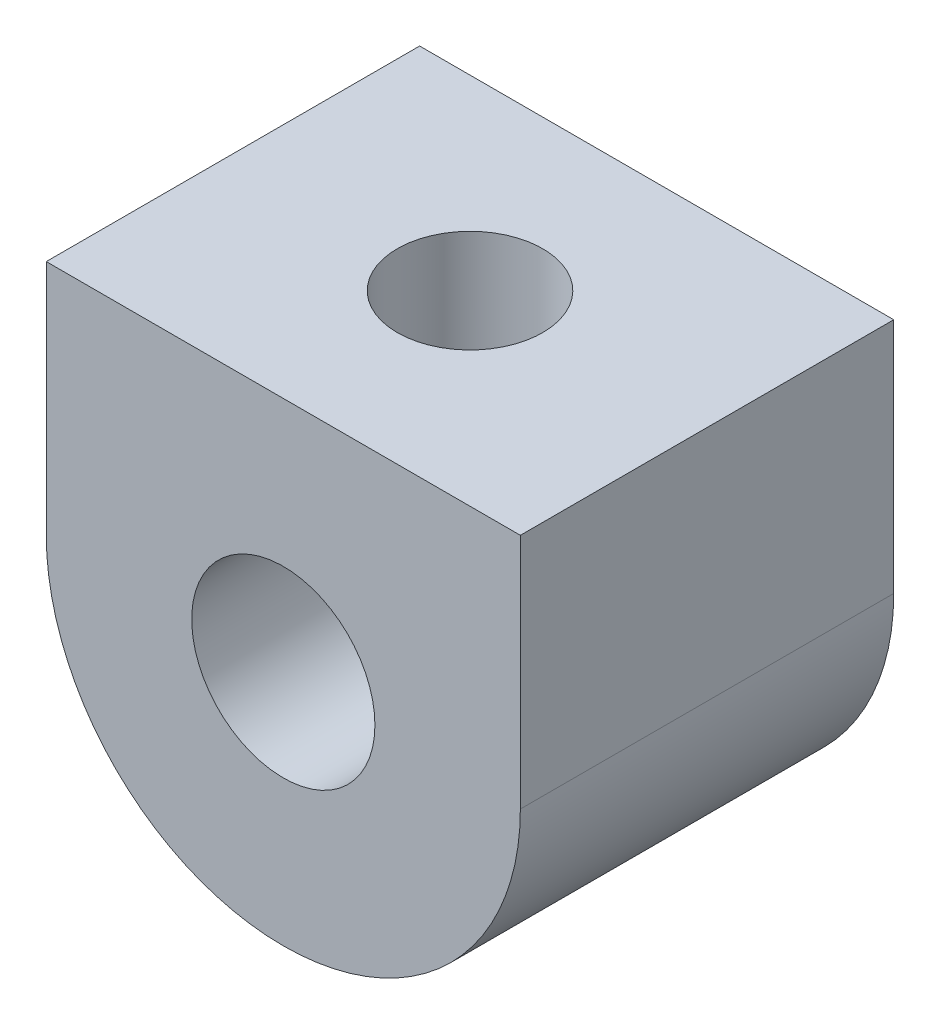
ISO-10303-21;
HEADER;
FILE_DESCRIPTION(('STEP AP214'),'2;1');
FILE_NAME('part.step','',(''),(''),'','','');
FILE_SCHEMA(('AUTOMOTIVE_DESIGN { 1 0 10303 214 1 1 1 1 }'));
ENDSEC;
DATA;
#1=APPLICATION_CONTEXT('core data for automotive mechanical design processes');
#2=APPLICATION_PROTOCOL_DEFINITION('international standard','automotive_design',2000,#1);
#3=PRODUCT_CONTEXT('',#1,'mechanical');
#4=PRODUCT('Part','Part','',(#3));
#5=PRODUCT_RELATED_PRODUCT_CATEGORY('part','',(#4));
#6=PRODUCT_DEFINITION_FORMATION('','',#4);
#7=PRODUCT_DEFINITION_CONTEXT('part definition',#1,'design');
#8=PRODUCT_DEFINITION('design','',#6,#7);
#9=PRODUCT_DEFINITION_SHAPE('','',#8);
#10=(LENGTH_UNIT() NAMED_UNIT(*) SI_UNIT(.MILLI.,.METRE.));
#11=(NAMED_UNIT(*) PLANE_ANGLE_UNIT() SI_UNIT($,.RADIAN.));
#12=(NAMED_UNIT(*) SI_UNIT($,.STERADIAN.) SOLID_ANGLE_UNIT());
#13=UNCERTAINTY_MEASURE_WITH_UNIT(LENGTH_MEASURE(1.E-05),#10,'distance_accuracy_value','');
#14=(GEOMETRIC_REPRESENTATION_CONTEXT(3) GLOBAL_UNCERTAINTY_ASSIGNED_CONTEXT((#13)) GLOBAL_UNIT_ASSIGNED_CONTEXT((#10,
#11,#12)) REPRESENTATION_CONTEXT('',''));
#15=CARTESIAN_POINT('',(0.,0.,0.));
#16=DIRECTION('',(0.,0.,1.));
#17=DIRECTION('',(1.,0.,0.));
#18=AXIS2_PLACEMENT_3D('',#15,#16,#17);
#19=CARTESIAN_POINT('',(0.,0.,16.301974));
#20=DIRECTION('',(0.,0.,1.));
#21=DIRECTION('',(1.,0.,0.));
#22=AXIS2_PLACEMENT_3D('',#19,#20,#21);
#23=PLANE('',#22);
#24=CARTESIAN_POINT('',(0.,0.,16.301974));
#25=DIRECTION('',(0.,0.,1.));
#26=DIRECTION('',(1.,0.,0.));
#27=AXIS2_PLACEMENT_3D('',#24,#25,#26);
#28=CIRCLE('',#27,10.349992);
#29=CARTESIAN_POINT('',(-10.349992,0.,16.301974));
#30=VERTEX_POINT('',#29);
#31=CARTESIAN_POINT('',(10.349992,0.,16.301974));
#32=VERTEX_POINT('',#31);
#33=EDGE_CURVE('E90',#30,#32,#28,.T.);
#34=ORIENTED_EDGE('',*,*,#33,.T.);
#35=DIRECTION('',(0.,1.,0.));
#36=VECTOR('',#35,1.);
#37=CARTESIAN_POINT('',(10.349992,10.349992,16.301974));
#38=LINE('',#37,#36);
#39=CARTESIAN_POINT('',(10.349992,10.349992,16.301974));
#40=VERTEX_POINT('',#39);
#41=EDGE_CURVE('E85',#32,#40,#38,.T.);
#42=ORIENTED_EDGE('',*,*,#41,.T.);
#43=DIRECTION('',(-1.,0.,0.));
#44=VECTOR('',#43,1.);
#45=CARTESIAN_POINT('',(0.,10.349992,16.301974));
#46=LINE('',#45,#44);
#47=CARTESIAN_POINT('',(-10.349992,10.349992,16.301974));
#48=VERTEX_POINT('',#47);
#49=EDGE_CURVE('E88',#40,#48,#46,.T.);
#50=ORIENTED_EDGE('',*,*,#49,.T.);
#51=DIRECTION('',(0.,-1.,0.));
#52=VECTOR('',#51,1.);
#53=CARTESIAN_POINT('',(-10.349992,0.,16.301974));
#54=LINE('',#53,#52);
#55=EDGE_CURVE('E56',#48,#30,#54,.T.);
#56=ORIENTED_EDGE('',*,*,#55,.T.);
#57=EDGE_LOOP('',(#34,#42,#50,#56));
#58=FACE_BOUND('',#57,.T.);
#59=CARTESIAN_POINT('',(0.,0.,16.301974));
#60=DIRECTION('',(0.,0.,1.));
#61=DIRECTION('',(1.,0.,0.));
#62=AXIS2_PLACEMENT_3D('',#59,#60,#61);
#63=CIRCLE('',#62,3.999992);
#64=CARTESIAN_POINT('',(3.999992,0.,16.301974));
#65=VERTEX_POINT('',#64);
#66=EDGE_CURVE('E106',#65,#65,#63,.T.);
#67=ORIENTED_EDGE('',*,*,#66,.F.);
#68=EDGE_LOOP('',(#67));
#69=FACE_BOUND('',#68,.T.);
#70=ADVANCED_FACE('F39',(#58,#69),#23,.T.);
#71=CARTESIAN_POINT('',(0.,0.,0.));
#72=DIRECTION('',(0.,0.,1.));
#73=DIRECTION('',(1.,0.,0.));
#74=AXIS2_PLACEMENT_3D('',#71,#72,#73);
#75=PLANE('',#74);
#76=CARTESIAN_POINT('',(0.,0.,0.));
#77=DIRECTION('',(0.,0.,1.));
#78=DIRECTION('',(1.,0.,0.));
#79=AXIS2_PLACEMENT_3D('',#76,#77,#78);
#80=CIRCLE('',#79,10.349992);
#81=CARTESIAN_POINT('',(-10.349992,0.,0.));
#82=VERTEX_POINT('',#81);
#83=CARTESIAN_POINT('',(10.349992,0.,0.));
#84=VERTEX_POINT('',#83);
#85=EDGE_CURVE('E103',#82,#84,#80,.T.);
#86=ORIENTED_EDGE('',*,*,#85,.F.);
#87=DIRECTION('',(0.,-1.,0.));
#88=VECTOR('',#87,1.);
#89=CARTESIAN_POINT('',(-10.349992,0.,0.));
#90=LINE('',#89,#88);
#91=CARTESIAN_POINT('',(-10.349992,10.349992,0.));
#92=VERTEX_POINT('',#91);
#93=EDGE_CURVE('E78',#92,#82,#90,.T.);
#94=ORIENTED_EDGE('',*,*,#93,.F.);
#95=DIRECTION('',(-1.,0.,0.));
#96=VECTOR('',#95,1.);
#97=CARTESIAN_POINT('',(-10.349992,10.349992,0.));
#98=LINE('',#97,#96);
#99=CARTESIAN_POINT('',(10.349992,10.349992,0.));
#100=VERTEX_POINT('',#99);
#101=EDGE_CURVE('E72',#100,#92,#98,.T.);
#102=ORIENTED_EDGE('',*,*,#101,.F.);
#103=DIRECTION('',(0.,1.,0.));
#104=VECTOR('',#103,1.);
#105=CARTESIAN_POINT('',(10.349992,10.349992,0.));
#106=LINE('',#105,#104);
#107=EDGE_CURVE('E95',#84,#100,#106,.T.);
#108=ORIENTED_EDGE('',*,*,#107,.F.);
#109=EDGE_LOOP('',(#86,#94,#102,#108));
#110=FACE_BOUND('',#109,.T.);
#111=CARTESIAN_POINT('',(0.,0.,0.));
#112=DIRECTION('',(0.,0.,1.));
#113=DIRECTION('',(1.,0.,0.));
#114=AXIS2_PLACEMENT_3D('',#111,#112,#113);
#115=CIRCLE('',#114,3.999992);
#116=CARTESIAN_POINT('',(3.999992,0.,0.));
#117=VERTEX_POINT('',#116);
#118=EDGE_CURVE('E118',#117,#117,#115,.T.);
#119=ORIENTED_EDGE('',*,*,#118,.T.);
#120=EDGE_LOOP('',(#119));
#121=FACE_BOUND('',#120,.T.);
#122=ADVANCED_FACE('F114',(#110,#121),#75,.F.);
#123=CARTESIAN_POINT('',(0.,0.,16.301974));
#124=DIRECTION('',(0.,0.,-1.));
#125=DIRECTION('',(-1.,0.,0.));
#126=AXIS2_PLACEMENT_3D('',#123,#124,#125);
#127=CYLINDRICAL_SURFACE('',#126,10.349992);
#128=ORIENTED_EDGE('',*,*,#85,.T.);
#129=DIRECTION('',(0.,0.,-1.));
#130=VECTOR('',#129,1.);
#131=CARTESIAN_POINT('',(10.349992,0.,16.301974));
#132=LINE('',#131,#130);
#133=EDGE_CURVE('E11',#32,#84,#132,.T.);
#134=ORIENTED_EDGE('',*,*,#133,.F.);
#135=ORIENTED_EDGE('',*,*,#33,.F.);
#136=DIRECTION('',(0.,0.,-1.));
#137=VECTOR('',#136,1.);
#138=CARTESIAN_POINT('',(-10.349992,0.,16.301974));
#139=LINE('',#138,#137);
#140=EDGE_CURVE('E99',#30,#82,#139,.T.);
#141=ORIENTED_EDGE('',*,*,#140,.T.);
#142=EDGE_LOOP('',(#128,#134,#135,#141));
#143=FACE_BOUND('',#142,.T.);
#144=ADVANCED_FACE('F41',(#143),#127,.T.);
#145=CARTESIAN_POINT('',(10.349992,10.349992,16.301974));
#146=DIRECTION('',(-1.,0.,0.));
#147=DIRECTION('',(0.,0.,1.));
#148=AXIS2_PLACEMENT_3D('',#145,#146,#147);
#149=PLANE('',#148);
#150=ORIENTED_EDGE('',*,*,#107,.T.);
#151=DIRECTION('',(0.,0.,-1.));
#152=VECTOR('',#151,1.);
#153=CARTESIAN_POINT('',(10.349992,10.349992,16.301974));
#154=LINE('',#153,#152);
#155=EDGE_CURVE('E48',#40,#100,#154,.T.);
#156=ORIENTED_EDGE('',*,*,#155,.F.);
#157=ORIENTED_EDGE('',*,*,#41,.F.);
#158=ORIENTED_EDGE('',*,*,#133,.T.);
#159=EDGE_LOOP('',(#150,#156,#157,#158));
#160=FACE_BOUND('',#159,.T.);
#161=ADVANCED_FACE('F94',(#160),#149,.F.);
#162=CARTESIAN_POINT('',(-10.349992,10.349992,16.301974));
#163=DIRECTION('',(0.,-1.,0.));
#164=DIRECTION('',(0.,0.,-1.));
#165=AXIS2_PLACEMENT_3D('',#162,#163,#164);
#166=PLANE('',#165);
#167=CARTESIAN_POINT('',(0.,10.349992,8.150987));
#168=DIRECTION('',(0.,1.,0.));
#169=DIRECTION('',(0.,0.,1.));
#170=AXIS2_PLACEMENT_3D('',#167,#168,#169);
#171=CIRCLE('',#170,3.175);
#172=CARTESIAN_POINT('',(0.,10.349992,11.325987));
#173=VERTEX_POINT('',#172);
#174=EDGE_CURVE('E121',#173,#173,#171,.T.);
#175=ORIENTED_EDGE('',*,*,#174,.F.);
#176=EDGE_LOOP('',(#175));
#177=FACE_BOUND('',#176,.T.);
#178=ORIENTED_EDGE('',*,*,#101,.T.);
#179=DIRECTION('',(0.,0.,-1.));
#180=VECTOR('',#179,1.);
#181=CARTESIAN_POINT('',(-10.349992,10.349992,16.301974));
#182=LINE('',#181,#180);
#183=EDGE_CURVE('E96',#48,#92,#182,.T.);
#184=ORIENTED_EDGE('',*,*,#183,.F.);
#185=ORIENTED_EDGE('',*,*,#49,.F.);
#186=ORIENTED_EDGE('',*,*,#155,.T.);
#187=EDGE_LOOP('',(#178,#184,#185,#186));
#188=FACE_BOUND('',#187,.T.);
#189=ADVANCED_FACE('F97',(#177,#188),#166,.F.);
#190=CARTESIAN_POINT('',(-10.349992,0.,16.301974));
#191=DIRECTION('',(1.,0.,0.));
#192=DIRECTION('',(0.,0.,-1.));
#193=AXIS2_PLACEMENT_3D('',#190,#191,#192);
#194=PLANE('',#193);
#195=ORIENTED_EDGE('',*,*,#93,.T.);
#196=ORIENTED_EDGE('',*,*,#140,.F.);
#197=ORIENTED_EDGE('',*,*,#55,.F.);
#198=ORIENTED_EDGE('',*,*,#183,.T.);
#199=EDGE_LOOP('',(#195,#196,#197,#198));
#200=FACE_BOUND('',#199,.T.);
#201=ADVANCED_FACE('F111',(#200),#194,.F.);
#202=CARTESIAN_POINT('',(0.,0.,16.301974));
#203=DIRECTION('',(0.,0.,-1.));
#204=DIRECTION('',(-1.,0.,0.));
#205=AXIS2_PLACEMENT_3D('',#202,#203,#204);
#206=CYLINDRICAL_SURFACE('',#205,3.999992);
#207=CARTESIAN_POINT('',(0.,3.999992,11.325987));
#208=CARTESIAN_POINT('',(0.0764201524682931,3.99999170906093,11.3259867011535));
#209=CARTESIAN_POINT('',(0.152844768826001,3.99779718336271,11.3232232527382));
#210=CARTESIAN_POINT('',(0.305078280690546,3.98907019279326,11.3122179243916));
#211=CARTESIAN_POINT('',(0.380886879226333,3.98253574831137,11.3039735443863));
#212=CARTESIAN_POINT('',(0.531354391850129,3.96526645626063,11.282132525921));
#213=CARTESIAN_POINT('',(0.606011544591902,3.95452573110043,11.2685283979261));
#214=CARTESIAN_POINT('',(0.753532310677379,3.92908920862785,11.2361982584159));
#215=CARTESIAN_POINT('',(0.826395103545464,3.91439163738734,11.2174699495728));
#216=CARTESIAN_POINT('',(1.04059319784093,3.86502331099184,11.1542847333464));
#217=CARTESIAN_POINT('',(1.17865822429612,3.82494160032923,11.1026591614401));
#218=CARTESIAN_POINT('',(1.443015316839,3.73327061284736,10.9828542268298));
#219=CARTESIAN_POINT('',(1.56930652605034,3.68168049939368,10.9146736605838));
#220=CARTESIAN_POINT('',(1.85031496533093,3.55074355122578,10.7380994150622));
#221=CARTESIAN_POINT('',(1.99985268322663,3.46795512967257,10.6239421624735));
#222=CARTESIAN_POINT('',(2.20567459285971,3.33790364548653,10.4366577875153));
#223=CARTESIAN_POINT('',(2.27130993002217,3.29348347556521,10.3714132370476));
#224=CARTESIAN_POINT('',(2.39634891625606,3.20364703806688,10.2358436693441));
#225=CARTESIAN_POINT('',(2.45575502945502,3.1582311730238,10.1655206797453));
#226=CARTESIAN_POINT('',(2.56911760314859,3.06675078398574,10.0188697304842));
#227=CARTESIAN_POINT('',(2.62297686195875,3.02068695830982,9.94246640143855));
#228=CARTESIAN_POINT('',(2.72408134395716,2.92983508145708,9.78463074147792));
#229=CARTESIAN_POINT('',(2.77132451622418,2.8850474292934,9.70319686236631));
#230=CARTESIAN_POINT('',(2.85879317505296,2.79839508579409,9.53548870958345));
#231=CARTESIAN_POINT('',(2.89903798628882,2.75652254328452,9.44922866318111));
#232=CARTESIAN_POINT('',(2.97219327779644,2.67748035072502,9.27165902907376));
#233=CARTESIAN_POINT('',(3.00510997999557,2.64030672274561,9.1803538078332));
#234=CARTESIAN_POINT('',(3.06761713986995,2.56755085838339,8.9776183241923));
#235=CARTESIAN_POINT('',(3.09583083774778,2.53317673182661,8.8653067121427));
#236=CARTESIAN_POINT('',(3.14003940451433,2.47817699528291,8.63517576494079));
#237=CARTESIAN_POINT('',(3.15606393551703,2.45751802541707,8.51737054538399));
#238=CARTESIAN_POINT('',(3.17474914652227,2.43334593463208,8.2778640491655));
#239=CARTESIAN_POINT('',(3.17729964464791,2.42997418392342,8.1561388152743));
#240=CARTESIAN_POINT('',(3.16846774865672,2.44147120267906,7.9140243745368));
#241=CARTESIAN_POINT('',(3.15707230196813,2.45635706020332,7.79363652588156));
#242=CARTESIAN_POINT('',(3.11841700647846,2.50529493966078,7.53821334714582));
#243=CARTESIAN_POINT('',(3.08882416776139,2.54213425722156,7.40409244409449));
#244=CARTESIAN_POINT('',(3.01441228025947,2.62992999537597,7.1448825803109));
#245=CARTESIAN_POINT('',(2.96954902956073,2.6809273179864,7.01982113231154));
#246=CARTESIAN_POINT('',(2.88000736261499,2.77643599266738,6.81104217104248));
#247=CARTESIAN_POINT('',(2.838396798028,2.81911414914011,6.7251155035067));
#248=CARTESIAN_POINT('',(2.74826777443825,2.90704712702707,6.55830272247074));
#249=CARTESIAN_POINT('',(2.69974627138771,2.95230307857841,6.47741885285412));
#250=CARTESIAN_POINT('',(2.59600343367509,3.04392732574603,6.32062377535256));
#251=CARTESIAN_POINT('',(2.54077682526506,3.0902964736241,6.24471655494707));
#252=CARTESIAN_POINT('',(2.42378635847876,3.18288903444108,6.09801352650583));
#253=CARTESIAN_POINT('',(2.36201918357586,3.22911236108706,6.02722034254679));
#254=CARTESIAN_POINT('',(2.16392635212314,3.36803458347904,5.81964632541459));
#255=CARTESIAN_POINT('',(2.01710203207852,3.45885683946416,5.69116167989439));
#256=CARTESIAN_POINT('',(1.77755072755374,3.58446779724067,5.5183819123927));
#257=CARTESIAN_POINT('',(1.69454197561839,3.62454487862247,5.46414226857043));
#258=CARTESIAN_POINT('',(1.52228702609582,3.70019096540315,5.36293345156385));
#259=CARTESIAN_POINT('',(1.43304373825836,3.73576205229485,5.3159609191846));
#260=CARTESIAN_POINT('',(1.21023774104306,3.81502945098968,5.21216302692044));
#261=CARTESIAN_POINT('',(1.07371843769143,3.85592414162665,5.15940306015492));
#262=CARTESIAN_POINT('',(0.791534058123141,3.92357308954037,5.07270000482878));
#263=CARTESIAN_POINT('',(0.645876021578844,3.9503380850244,5.03874262582008));
#264=CARTESIAN_POINT('',(0.348399322183865,3.98761888067492,4.99155561534416));
#265=CARTESIAN_POINT('',(0.196554378712527,3.99805584065299,4.97842654947537));
#266=CARTESIAN_POINT('',(-0.107635365857988,4.00143398134721,4.97417004705894));
#267=CARTESIAN_POINT('',(-0.259980101375985,3.99437737249061,4.98303983081233));
#268=CARTESIAN_POINT('',(-0.548806937749803,3.96462561264276,5.02064183186426));
#269=CARTESIAN_POINT('',(-0.685622433706433,3.94314152182204,5.04783640835983));
#270=CARTESIAN_POINT('',(-0.952083033858267,3.88741815245626,5.11895863651966));
#271=CARTESIAN_POINT('',(-1.0817258600334,3.85317484802558,5.16289156969815));
#272=CARTESIAN_POINT('',(-1.34011888625492,3.77142315288669,5.26905209550182));
#273=CARTESIAN_POINT('',(-1.46819471554869,3.72316453193368,5.33232994985261));
#274=CARTESIAN_POINT('',(-1.71191344927169,3.61758856723252,5.47333510102658));
#275=CARTESIAN_POINT('',(-1.82755614035384,3.56027106807974,5.55106264573752));
#276=CARTESIAN_POINT('',(-2.06665154254878,3.4279660315775,5.73510170838895));
#277=CARTESIAN_POINT('',(-2.18736593654031,3.35169583026037,5.84403683618337));
#278=CARTESIAN_POINT('',(-2.41016976062434,3.19524311456047,6.07784972242619));
#279=CARTESIAN_POINT('',(-2.51219849802495,3.11504888708576,6.20277726915328));
#280=CARTESIAN_POINT('',(-2.66006787321715,2.98820468544809,6.41486792648925));
#281=CARTESIAN_POINT('',(-2.71214027906522,2.94087000539524,6.4973480234314));
#282=CARTESIAN_POINT('',(-2.80899575208937,2.84849964372823,6.66781917101945));
#283=CARTESIAN_POINT('',(-2.85377483222696,2.8034652287701,6.7558131998115));
#284=CARTESIAN_POINT('',(-2.93541129110254,2.7178632423184,6.93698004240776));
#285=CARTESIAN_POINT('',(-2.97230144759639,2.67727754385612,7.03012932035672));
#286=CARTESIAN_POINT('',(-3.03768385502439,2.60285698696341,7.2218259747362));
#287=CARTESIAN_POINT('',(-3.0661873626146,2.5690130994979,7.32036590301294));
#288=CARTESIAN_POINT('',(-3.11562783633092,2.5088717222822,7.52981151643891));
#289=CARTESIAN_POINT('',(-3.13587434037789,2.48329079472888,7.64109702887479));
#290=CARTESIAN_POINT('',(-3.16435850035436,2.44690291529942,7.8674247880795));
#291=CARTESIAN_POINT('',(-3.17262348600591,2.43606234433738,7.98245787137615));
#292=CARTESIAN_POINT('',(-3.17649195247935,2.43101862831518,8.2135291761449));
#293=CARTESIAN_POINT('',(-3.17205156704929,2.43687312399657,8.3295694975815));
#294=CARTESIAN_POINT('',(-3.1508239920807,2.46424803075378,8.55870206609445));
#295=CARTESIAN_POINT('',(-3.13401535772665,2.48579565085,8.67178883904164));
#296=CARTESIAN_POINT('',(-3.08182550803855,2.55039213827513,8.92911936158599));
#297=CARTESIAN_POINT('',(-3.04213264080678,2.59820267534003,9.07125259443149));
#298=CARTESIAN_POINT('',(-2.94575287696846,2.70698072401493,9.34442141173653));
#299=CARTESIAN_POINT('',(-2.88901303228219,2.76798906038118,9.47542076382511));
#300=CARTESIAN_POINT('',(-2.77940752583487,2.87731498443153,9.6889439054498));
#301=CARTESIAN_POINT('',(-2.73038709278259,2.9240274255505,9.77431856220123));
#302=CARTESIAN_POINT('',(-2.62508280372217,3.01892522453508,9.9396112104994));
#303=CARTESIAN_POINT('',(-2.56879608243111,3.06711115768553,10.0195270303766));
#304=CARTESIAN_POINT('',(-2.38934620339838,3.21161222148973,10.2509287603855));
#305=CARTESIAN_POINT('',(-2.25545995506679,3.30801151834321,10.3943267961786));
#306=CARTESIAN_POINT('',(-1.98441579843781,3.47608649846195,10.634911639601));
#307=CARTESIAN_POINT('',(-1.85144153981534,3.54921729038588,10.7358193169706));
#308=CARTESIAN_POINT('',(-1.56699488943738,3.68362700516951,10.9174902716688));
#309=CARTESIAN_POINT('',(-1.41554792827044,3.7449219281008,10.9982807873759));
#310=CARTESIAN_POINT('',(-1.12405426728425,3.84131719506695,11.1238172027964));
#311=CARTESIAN_POINT('',(-0.986572389477884,3.87911524106895,11.1723817109523));
#312=CARTESIAN_POINT('',(-0.774319461298541,3.92499964170298,11.2309957051328));
#313=CARTESIAN_POINT('',(-0.702605684781185,3.93848775741063,11.2481558913516));
#314=CARTESIAN_POINT('',(-0.5575729725134,3.9616194419626,11.277518756979));
#315=CARTESIAN_POINT('',(-0.484254748854556,3.97126468126983,11.2897235904778));
#316=CARTESIAN_POINT('',(-0.342618791741547,3.98587431330085,11.3081869804686));
#317=CARTESIAN_POINT('',(-0.274386632522019,3.99115883224245,11.3148525319603));
#318=CARTESIAN_POINT('',(-0.137437583013518,3.99821816573758,11.3237531297007));
#319=CARTESIAN_POINT('',(-0.0687205963582442,3.9999922616261,11.3259872687368));
#320=CARTESIAN_POINT('',(0.,3.999992,11.325987));
#321=B_SPLINE_CURVE_WITH_KNOTS('',3,(#207,#208,#209,#210,#211,#212,#213,#214,#215,#216,#217,
#218,#219,#220,#221,#222,#223,#224,#225,#226,#227,#228,#229,#230,#231,#232,#233,#234,#235,#236,
#237,#238,#239,#240,#241,#242,#243,#244,#245,#246,#247,#248,#249,#250,#251,#252,#253,#254,#255,
#256,#257,#258,#259,#260,#261,#262,#263,#264,#265,#266,#267,#268,#269,#270,#271,#272,#273,#274,
#275,#276,#277,#278,#279,#280,#281,#282,#283,#284,#285,#286,#287,#288,#289,#290,#291,#292,#293,
#294,#295,#296,#297,#298,#299,#300,#301,#302,#303,#304,#305,#306,#307,#308,#309,#310,#311,#312,
#313,#314,#315,#316,#317,#318,#319,#320),.UNSPECIFIED.,.T.,.F.,(4,2,2,2,2,2,2,2,2,2,2,2,2,2,2,2,
2,2,2,2,2,2,2,2,2,2,2,2,2,2,2,2,2,2,2,2,2,2,2,2,2,2,2,2,2,2,2,2,2,2,2,2,2,2,2,2,4),(0.,
0.229187124745345,0.458478862775726,0.688092148438184,0.917808545950548,1.37386410004021,
1.82995281913018,2.4430395067898,2.75077425610792,3.05838681022652,3.37070226455366,
3.68311432028229,3.99464951536302,4.30591918421451,4.66703450298218,5.0272682178038,
5.39044318069321,5.75395831377346,6.17822396144854,6.60372828728062,6.91708322111166,
7.23057660709476,7.54431818124685,7.858219613221,8.49993865759808,8.82037770774834,
9.1406681907184,9.59458549157803,10.0481573284688,10.5039125583553,10.959610203512,
11.3811721177593,11.802867159272,12.2535590913083,12.7042587557822,13.2411815939502,
13.7798186182599,14.1047414121583,14.4298412395342,14.7535628694133,15.0768479933103,
15.423351698091,15.7690637810255,16.1159708997401,16.463480928477,16.9262832116192,
17.3905380909478,17.7170510444413,18.0436931458715,18.6960205291622,19.2407307669186,
19.7846994137949,20.2345029838256,20.4591510585207,20.6837013739493,20.8897550392456,
21.0958508841429),.UNSPECIFIED.);
#322=CARTESIAN_POINT('',(0.,3.999992,11.325987));
#323=VERTEX_POINT('',#322);
#324=EDGE_CURVE('E124',#323,#323,#321,.T.);
#325=ORIENTED_EDGE('',*,*,#324,.T.);
#326=EDGE_LOOP('',(#325));
#327=FACE_BOUND('',#326,.T.);
#328=ORIENTED_EDGE('',*,*,#66,.T.);
#329=EDGE_LOOP('',(#328));
#330=FACE_BOUND('',#329,.T.);
#331=ORIENTED_EDGE('',*,*,#118,.F.);
#332=EDGE_LOOP('',(#331));
#333=FACE_BOUND('',#332,.T.);
#334=ADVANCED_FACE('F137',(#327,#330,#333),#206,.F.);
#335=CARTESIAN_POINT('',(0.,-10.350992,8.150987));
#336=DIRECTION('',(0.,1.,0.));
#337=DIRECTION('',(0.,0.,1.));
#338=AXIS2_PLACEMENT_3D('',#335,#336,#337);
#339=CYLINDRICAL_SURFACE('',#338,3.175);
#340=ORIENTED_EDGE('',*,*,#324,.F.);
#341=EDGE_LOOP('',(#340));
#342=FACE_BOUND('',#341,.T.);
#343=ORIENTED_EDGE('',*,*,#174,.T.);
#344=EDGE_LOOP('',(#343));
#345=FACE_BOUND('',#344,.T.);
#346=ADVANCED_FACE('F132',(#342,#345),#339,.F.);
#347=CLOSED_SHELL('',(#70,#122,#144,#161,#189,#201,#334,#346));
#348=MANIFOLD_SOLID_BREP('B2',#347);
#349=ADVANCED_BREP_SHAPE_REPRESENTATION('',(#18,#348),#14);
#350=SHAPE_DEFINITION_REPRESENTATION(#9,#349);
ENDSEC;
END-ISO-10303-21;
